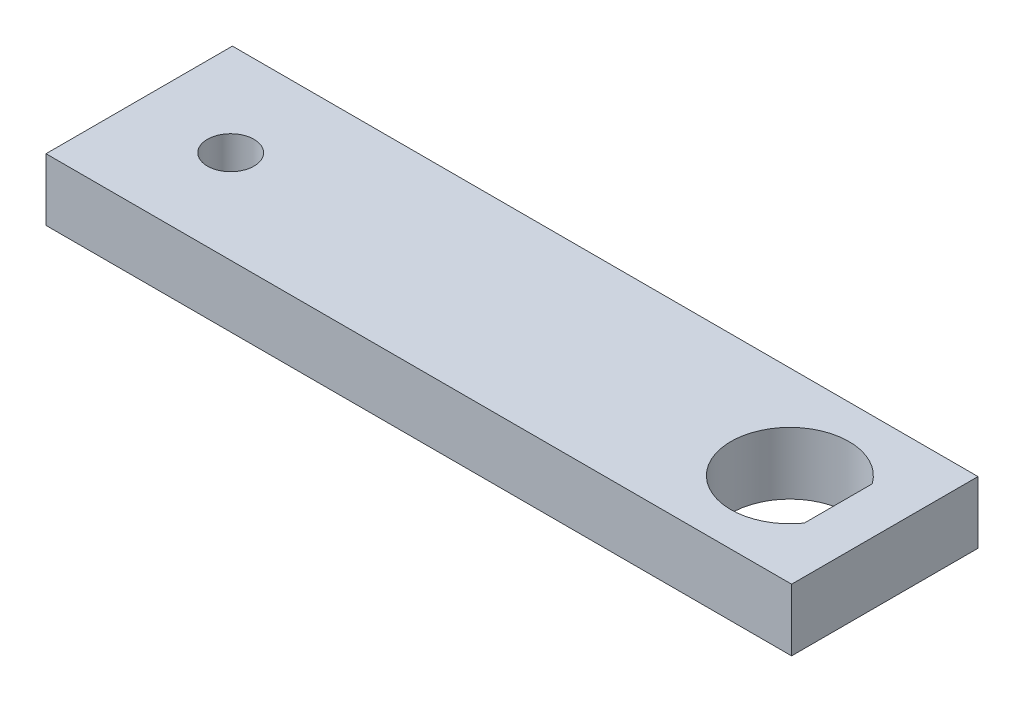
ISO-10303-21;
HEADER;
FILE_DESCRIPTION(('STEP AP214'),'2;1');
FILE_NAME('part.step','',(''),(''),'','','');
FILE_SCHEMA(('AUTOMOTIVE_DESIGN { 1 0 10303 214 1 1 1 1 }'));
ENDSEC;
DATA;
#1=APPLICATION_CONTEXT('core data for automotive mechanical design processes');
#2=APPLICATION_PROTOCOL_DEFINITION('international standard','automotive_design',2000,#1);
#3=PRODUCT_CONTEXT('',#1,'mechanical');
#4=PRODUCT('Part','Part','',(#3));
#5=PRODUCT_RELATED_PRODUCT_CATEGORY('part','',(#4));
#6=PRODUCT_DEFINITION_FORMATION('','',#4);
#7=PRODUCT_DEFINITION_CONTEXT('part definition',#1,'design');
#8=PRODUCT_DEFINITION('design','',#6,#7);
#9=PRODUCT_DEFINITION_SHAPE('','',#8);
#10=(LENGTH_UNIT() NAMED_UNIT(*) SI_UNIT(.MILLI.,.METRE.));
#11=(NAMED_UNIT(*) PLANE_ANGLE_UNIT() SI_UNIT($,.RADIAN.));
#12=(NAMED_UNIT(*) SI_UNIT($,.STERADIAN.) SOLID_ANGLE_UNIT());
#13=UNCERTAINTY_MEASURE_WITH_UNIT(LENGTH_MEASURE(1.E-05),#10,'distance_accuracy_value','');
#14=(GEOMETRIC_REPRESENTATION_CONTEXT(3) GLOBAL_UNCERTAINTY_ASSIGNED_CONTEXT((#13)) GLOBAL_UNIT_ASSIGNED_CONTEXT((#10,
#11,#12)) REPRESENTATION_CONTEXT('',''));
#15=CARTESIAN_POINT('',(0.,0.,0.));
#16=DIRECTION('',(0.,0.,1.));
#17=DIRECTION('',(1.,0.,0.));
#18=AXIS2_PLACEMENT_3D('',#15,#16,#17);
#19=CARTESIAN_POINT('',(0.,6.35,0.));
#20=DIRECTION('',(0.,1.,0.));
#21=DIRECTION('',(0.,0.,1.));
#22=AXIS2_PLACEMENT_3D('',#19,#20,#21);
#23=PLANE('',#22);
#24=DIRECTION('',(0.,0.,1.));
#25=VECTOR('',#24,1.);
#26=CARTESIAN_POINT('',(-41.1151079136691,6.35,-16.2404676258993));
#27=LINE('',#26,#25);
#28=CARTESIAN_POINT('',(-41.1151079136691,6.35,-16.2404676258993));
#29=VERTEX_POINT('',#28);
#30=CARTESIAN_POINT('',(-41.1151079136691,6.35,2.80953237410072));
#31=VERTEX_POINT('',#30);
#32=EDGE_CURVE('E114',#29,#31,#27,.T.);
#33=ORIENTED_EDGE('',*,*,#32,.T.);
#34=DIRECTION('',(1.,0.,0.));
#35=VECTOR('',#34,1.);
#36=CARTESIAN_POINT('',(-41.1151079136691,6.35,2.80953237410072));
#37=LINE('',#36,#35);
#38=CARTESIAN_POINT('',(35.0848920863309,6.35,2.80953237410072));
#39=VERTEX_POINT('',#38);
#40=EDGE_CURVE('E117',#31,#39,#37,.T.);
#41=ORIENTED_EDGE('',*,*,#40,.T.);
#42=DIRECTION('',(0.,0.,-1.));
#43=VECTOR('',#42,1.);
#44=CARTESIAN_POINT('',(35.0848920863309,6.35,-16.2404676258993));
#45=LINE('',#44,#43);
#46=CARTESIAN_POINT('',(35.0848920863309,6.35,-16.2404676258993));
#47=VERTEX_POINT('',#46);
#48=EDGE_CURVE('E120',#39,#47,#45,.T.);
#49=ORIENTED_EDGE('',*,*,#48,.T.);
#50=DIRECTION('',(-1.,0.,0.));
#51=VECTOR('',#50,1.);
#52=CARTESIAN_POINT('',(-41.1151079136691,6.35,-16.2404676258993));
#53=LINE('',#52,#51);
#54=EDGE_CURVE('E122',#47,#29,#53,.T.);
#55=ORIENTED_EDGE('',*,*,#54,.T.);
#56=EDGE_LOOP('',(#33,#41,#49,#55));
#57=FACE_BOUND('',#56,.T.);
#58=CARTESIAN_POINT('',(-31.7651079136691,6.35,-6.71546762589928));
#59=DIRECTION('',(0.,1.,0.));
#60=DIRECTION('',(0.,0.,1.));
#61=AXIS2_PLACEMENT_3D('',#58,#59,#60);
#62=CIRCLE('',#61,2.38);
#63=CARTESIAN_POINT('',(-31.7651079136691,6.35,-4.33546762589928));
#64=VERTEX_POINT('',#63);
#65=EDGE_CURVE('E108',#64,#64,#62,.T.);
#66=ORIENTED_EDGE('',*,*,#65,.F.);
#67=EDGE_LOOP('',(#66));
#68=FACE_BOUND('',#67,.T.);
#69=DIRECTION('',(0.,0.,-1.));
#70=VECTOR('',#69,1.);
#71=CARTESIAN_POINT('',(30.3248920863309,6.35,-10.1821122572395));
#72=LINE('',#71,#70);
#73=CARTESIAN_POINT('',(30.3248920863309,6.35,-3.24882299455906));
#74=VERTEX_POINT('',#73);
#75=CARTESIAN_POINT('',(30.3248920863309,6.35,-10.1821122572395));
#76=VERTEX_POINT('',#75);
#77=EDGE_CURVE('E91',#74,#76,#72,.T.);
#78=ORIENTED_EDGE('',*,*,#77,.F.);
#79=CARTESIAN_POINT('',(25.3848920863309,6.35,-6.71546762589928));
#80=DIRECTION('',(0.,1.,0.));
#81=DIRECTION('',(0.,0.,1.));
#82=AXIS2_PLACEMENT_3D('',#79,#80,#81);
#83=CIRCLE('',#82,6.035);
#84=EDGE_CURVE('E97',#76,#74,#83,.T.);
#85=ORIENTED_EDGE('',*,*,#84,.F.);
#86=EDGE_LOOP('',(#78,#85));
#87=FACE_BOUND('',#86,.T.);
#88=ADVANCED_FACE('F39',(#57,#68,#87),#23,.T.);
#89=CARTESIAN_POINT('',(0.,0.,0.));
#90=DIRECTION('',(0.,1.,0.));
#91=DIRECTION('',(0.,0.,1.));
#92=AXIS2_PLACEMENT_3D('',#89,#90,#91);
#93=PLANE('',#92);
#94=CARTESIAN_POINT('',(-31.7651079136691,0.,-6.71546762589928));
#95=DIRECTION('',(0.,1.,0.));
#96=DIRECTION('',(0.,0.,1.));
#97=AXIS2_PLACEMENT_3D('',#94,#95,#96);
#98=CIRCLE('',#97,2.38);
#99=CARTESIAN_POINT('',(-31.7651079136691,0.,-4.33546762589928));
#100=VERTEX_POINT('',#99);
#101=EDGE_CURVE('E107',#100,#100,#98,.T.);
#102=ORIENTED_EDGE('',*,*,#101,.T.);
#103=EDGE_LOOP('',(#102));
#104=FACE_BOUND('',#103,.T.);
#105=DIRECTION('',(0.,0.,1.));
#106=VECTOR('',#105,1.);
#107=CARTESIAN_POINT('',(-41.1151079136691,0.,-16.2404676258993));
#108=LINE('',#107,#106);
#109=CARTESIAN_POINT('',(-41.1151079136691,0.,-16.2404676258993));
#110=VERTEX_POINT('',#109);
#111=CARTESIAN_POINT('',(-41.1151079136691,0.,2.80953237410072));
#112=VERTEX_POINT('',#111);
#113=EDGE_CURVE('E111',#110,#112,#108,.T.);
#114=ORIENTED_EDGE('',*,*,#113,.F.);
#115=DIRECTION('',(-1.,0.,0.));
#116=VECTOR('',#115,1.);
#117=CARTESIAN_POINT('',(-41.1151079136691,0.,-16.2404676258993));
#118=LINE('',#117,#116);
#119=CARTESIAN_POINT('',(35.0848920863309,0.,-16.2404676258993));
#120=VERTEX_POINT('',#119);
#121=EDGE_CURVE('E118',#120,#110,#118,.T.);
#122=ORIENTED_EDGE('',*,*,#121,.F.);
#123=DIRECTION('',(0.,0.,-1.));
#124=VECTOR('',#123,1.);
#125=CARTESIAN_POINT('',(35.0848920863309,0.,-16.2404676258993));
#126=LINE('',#125,#124);
#127=CARTESIAN_POINT('',(35.0848920863309,0.,2.80953237410072));
#128=VERTEX_POINT('',#127);
#129=EDGE_CURVE('E129',#128,#120,#126,.T.);
#130=ORIENTED_EDGE('',*,*,#129,.F.);
#131=DIRECTION('',(1.,0.,0.));
#132=VECTOR('',#131,1.);
#133=CARTESIAN_POINT('',(-41.1151079136691,0.,2.80953237410072));
#134=LINE('',#133,#132);
#135=EDGE_CURVE('E127',#112,#128,#134,.T.);
#136=ORIENTED_EDGE('',*,*,#135,.F.);
#137=EDGE_LOOP('',(#114,#122,#130,#136));
#138=FACE_BOUND('',#137,.T.);
#139=CARTESIAN_POINT('',(25.3848920863309,0.,-6.71546762589928));
#140=DIRECTION('',(0.,1.,0.));
#141=DIRECTION('',(0.,0.,1.));
#142=AXIS2_PLACEMENT_3D('',#139,#140,#141);
#143=CIRCLE('',#142,6.035);
#144=CARTESIAN_POINT('',(30.3248920863309,0.,-10.1821122572395));
#145=VERTEX_POINT('',#144);
#146=CARTESIAN_POINT('',(30.3248920863309,0.,-3.24882299455906));
#147=VERTEX_POINT('',#146);
#148=EDGE_CURVE('E61',#145,#147,#143,.T.);
#149=ORIENTED_EDGE('',*,*,#148,.T.);
#150=DIRECTION('',(0.,0.,-1.));
#151=VECTOR('',#150,1.);
#152=CARTESIAN_POINT('',(30.3248920863309,0.,-10.1821122572395));
#153=LINE('',#152,#151);
#154=EDGE_CURVE('E101',#147,#145,#153,.T.);
#155=ORIENTED_EDGE('',*,*,#154,.T.);
#156=EDGE_LOOP('',(#149,#155));
#157=FACE_BOUND('',#156,.T.);
#158=ADVANCED_FACE('F147',(#104,#138,#157),#93,.F.);
#159=CARTESIAN_POINT('',(-41.1151079136691,6.35,-16.2404676258993));
#160=DIRECTION('',(1.,0.,0.));
#161=DIRECTION('',(0.,0.,-1.));
#162=AXIS2_PLACEMENT_3D('',#159,#160,#161);
#163=PLANE('',#162);
#164=ORIENTED_EDGE('',*,*,#113,.T.);
#165=DIRECTION('',(0.,-1.,0.));
#166=VECTOR('',#165,1.);
#167=CARTESIAN_POINT('',(-41.1151079136691,6.35,2.80953237410072));
#168=LINE('',#167,#166);
#169=EDGE_CURVE('E11',#31,#112,#168,.T.);
#170=ORIENTED_EDGE('',*,*,#169,.F.);
#171=ORIENTED_EDGE('',*,*,#32,.F.);
#172=DIRECTION('',(0.,-1.,0.));
#173=VECTOR('',#172,1.);
#174=CARTESIAN_POINT('',(-41.1151079136691,6.35,-16.2404676258993));
#175=LINE('',#174,#173);
#176=EDGE_CURVE('E124',#29,#110,#175,.T.);
#177=ORIENTED_EDGE('',*,*,#176,.T.);
#178=EDGE_LOOP('',(#164,#170,#171,#177));
#179=FACE_BOUND('',#178,.T.);
#180=ADVANCED_FACE('F41',(#179),#163,.F.);
#181=CARTESIAN_POINT('',(-41.1151079136691,6.35,2.80953237410072));
#182=DIRECTION('',(0.,0.,-1.));
#183=DIRECTION('',(-1.,0.,0.));
#184=AXIS2_PLACEMENT_3D('',#181,#182,#183);
#185=PLANE('',#184);
#186=ORIENTED_EDGE('',*,*,#135,.T.);
#187=DIRECTION('',(0.,-1.,0.));
#188=VECTOR('',#187,1.);
#189=CARTESIAN_POINT('',(35.0848920863309,6.35,2.80953237410072));
#190=LINE('',#189,#188);
#191=EDGE_CURVE('E47',#39,#128,#190,.T.);
#192=ORIENTED_EDGE('',*,*,#191,.F.);
#193=ORIENTED_EDGE('',*,*,#40,.F.);
#194=ORIENTED_EDGE('',*,*,#169,.T.);
#195=EDGE_LOOP('',(#186,#192,#193,#194));
#196=FACE_BOUND('',#195,.T.);
#197=ADVANCED_FACE('F158',(#196),#185,.F.);
#198=CARTESIAN_POINT('',(35.0848920863309,6.35,-16.2404676258993));
#199=DIRECTION('',(-1.,0.,0.));
#200=DIRECTION('',(0.,0.,1.));
#201=AXIS2_PLACEMENT_3D('',#198,#199,#200);
#202=PLANE('',#201);
#203=ORIENTED_EDGE('',*,*,#129,.T.);
#204=DIRECTION('',(0.,-1.,0.));
#205=VECTOR('',#204,1.);
#206=CARTESIAN_POINT('',(35.0848920863309,6.35,-16.2404676258993));
#207=LINE('',#206,#205);
#208=EDGE_CURVE('E134',#47,#120,#207,.T.);
#209=ORIENTED_EDGE('',*,*,#208,.F.);
#210=ORIENTED_EDGE('',*,*,#48,.F.);
#211=ORIENTED_EDGE('',*,*,#191,.T.);
#212=EDGE_LOOP('',(#203,#209,#210,#211));
#213=FACE_BOUND('',#212,.T.);
#214=ADVANCED_FACE('F141',(#213),#202,.F.);
#215=CARTESIAN_POINT('',(-41.1151079136691,6.35,-16.2404676258993));
#216=DIRECTION('',(0.,0.,1.));
#217=DIRECTION('',(1.,0.,0.));
#218=AXIS2_PLACEMENT_3D('',#215,#216,#217);
#219=PLANE('',#218);
#220=ORIENTED_EDGE('',*,*,#121,.T.);
#221=ORIENTED_EDGE('',*,*,#176,.F.);
#222=ORIENTED_EDGE('',*,*,#54,.F.);
#223=ORIENTED_EDGE('',*,*,#208,.T.);
#224=EDGE_LOOP('',(#220,#221,#222,#223));
#225=FACE_BOUND('',#224,.T.);
#226=ADVANCED_FACE('F151',(#225),#219,.F.);
#227=CARTESIAN_POINT('',(-31.7651079136691,6.35,-6.71546762589928));
#228=DIRECTION('',(0.,-1.,0.));
#229=DIRECTION('',(0.,0.,-1.));
#230=AXIS2_PLACEMENT_3D('',#227,#228,#229);
#231=CYLINDRICAL_SURFACE('',#230,2.38);
#232=ORIENTED_EDGE('',*,*,#65,.T.);
#233=EDGE_LOOP('',(#232));
#234=FACE_BOUND('',#233,.T.);
#235=ORIENTED_EDGE('',*,*,#101,.F.);
#236=EDGE_LOOP('',(#235));
#237=FACE_BOUND('',#236,.T.);
#238=ADVANCED_FACE('F173',(#234,#237),#231,.F.);
#239=CARTESIAN_POINT('',(25.3848920863309,6.35,-6.71546762589928));
#240=DIRECTION('',(0.,-1.,0.));
#241=DIRECTION('',(0.,0.,-1.));
#242=AXIS2_PLACEMENT_3D('',#239,#240,#241);
#243=CYLINDRICAL_SURFACE('',#242,6.035);
#244=ORIENTED_EDGE('',*,*,#148,.F.);
#245=DIRECTION('',(0.,-1.,0.));
#246=VECTOR('',#245,1.);
#247=CARTESIAN_POINT('',(30.3248920863309,6.35,-10.1821122572395));
#248=LINE('',#247,#246);
#249=EDGE_CURVE('E93',#76,#145,#248,.T.);
#250=ORIENTED_EDGE('',*,*,#249,.F.);
#251=ORIENTED_EDGE('',*,*,#84,.T.);
#252=DIRECTION('',(0.,-1.,0.));
#253=VECTOR('',#252,1.);
#254=CARTESIAN_POINT('',(30.3248920863309,6.35,-3.24882299455906));
#255=LINE('',#254,#253);
#256=EDGE_CURVE('E54',#74,#147,#255,.T.);
#257=ORIENTED_EDGE('',*,*,#256,.T.);
#258=EDGE_LOOP('',(#244,#250,#251,#257));
#259=FACE_BOUND('',#258,.T.);
#260=ADVANCED_FACE('F99',(#259),#243,.F.);
#261=CARTESIAN_POINT('',(30.3248920863309,6.35,-10.1821122572395));
#262=DIRECTION('',(-1.,0.,0.));
#263=DIRECTION('',(0.,0.,1.));
#264=AXIS2_PLACEMENT_3D('',#261,#262,#263);
#265=PLANE('',#264);
#266=ORIENTED_EDGE('',*,*,#154,.F.);
#267=ORIENTED_EDGE('',*,*,#256,.F.);
#268=ORIENTED_EDGE('',*,*,#77,.T.);
#269=ORIENTED_EDGE('',*,*,#249,.T.);
#270=EDGE_LOOP('',(#266,#267,#268,#269));
#271=FACE_BOUND('',#270,.T.);
#272=ADVANCED_FACE('F92',(#271),#265,.T.);
#273=CLOSED_SHELL('',(#88,#158,#180,#197,#214,#226,#238,#260,#272));
#274=MANIFOLD_SOLID_BREP('B2',#273);
#275=ADVANCED_BREP_SHAPE_REPRESENTATION('',(#18,#274),#14);
#276=SHAPE_DEFINITION_REPRESENTATION(#9,#275);
ENDSEC;
END-ISO-10303-21;
